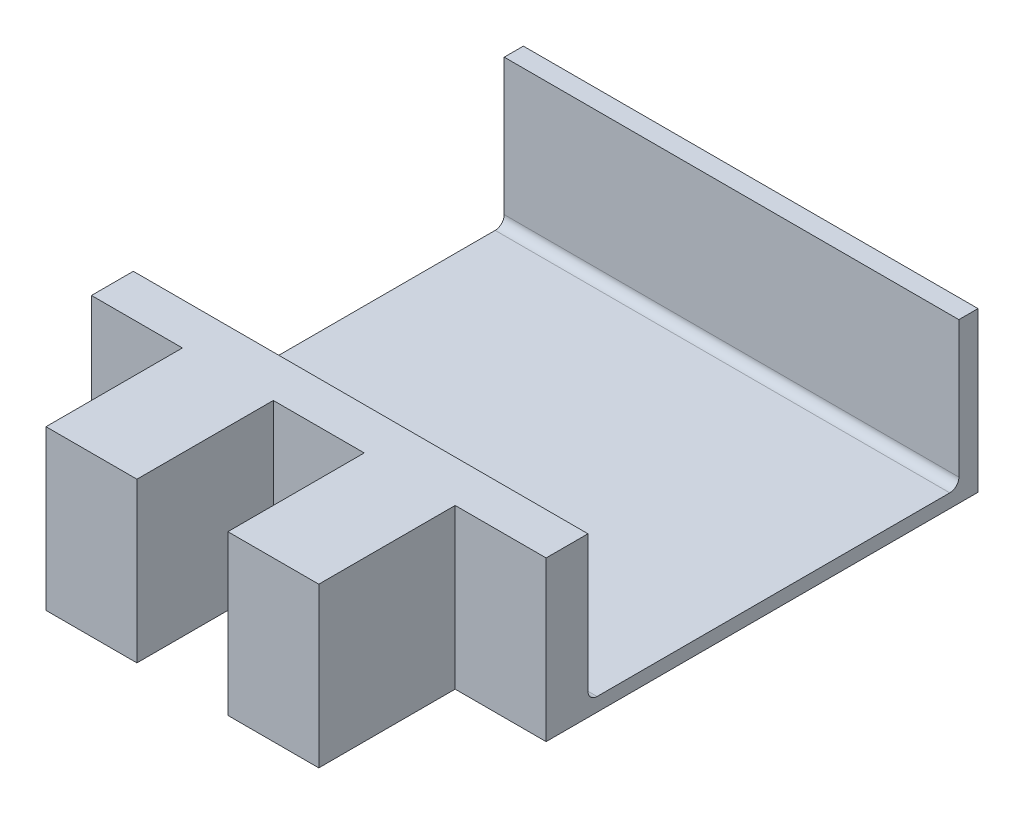
ISO-10303-21;
HEADER;
FILE_DESCRIPTION(('STEP AP214'),'2;1');
FILE_NAME('part.step','',(''),(''),'','','');
FILE_SCHEMA(('AUTOMOTIVE_DESIGN { 1 0 10303 214 1 1 1 1 }'));
ENDSEC;
DATA;
#1=APPLICATION_CONTEXT('core data for automotive mechanical design processes');
#2=APPLICATION_PROTOCOL_DEFINITION('international standard','automotive_design',2000,#1);
#3=PRODUCT_CONTEXT('',#1,'mechanical');
#4=PRODUCT('Part','Part','',(#3));
#5=PRODUCT_RELATED_PRODUCT_CATEGORY('part','',(#4));
#6=PRODUCT_DEFINITION_FORMATION('','',#4);
#7=PRODUCT_DEFINITION_CONTEXT('part definition',#1,'design');
#8=PRODUCT_DEFINITION('design','',#6,#7);
#9=PRODUCT_DEFINITION_SHAPE('','',#8);
#10=(LENGTH_UNIT() NAMED_UNIT(*) SI_UNIT(.MILLI.,.METRE.));
#11=(NAMED_UNIT(*) PLANE_ANGLE_UNIT() SI_UNIT($,.RADIAN.));
#12=(NAMED_UNIT(*) SI_UNIT($,.STERADIAN.) SOLID_ANGLE_UNIT());
#13=UNCERTAINTY_MEASURE_WITH_UNIT(LENGTH_MEASURE(1.E-05),#10,'distance_accuracy_value','');
#14=(GEOMETRIC_REPRESENTATION_CONTEXT(3) GLOBAL_UNCERTAINTY_ASSIGNED_CONTEXT((#13)) GLOBAL_UNIT_ASSIGNED_CONTEXT((#10,
#11,#12)) REPRESENTATION_CONTEXT('',''));
#15=CARTESIAN_POINT('',(0.,0.,0.));
#16=DIRECTION('',(0.,0.,1.));
#17=DIRECTION('',(1.,0.,0.));
#18=AXIS2_PLACEMENT_3D('',#15,#16,#17);
#19=CARTESIAN_POINT('',(0.,0.,80.));
#20=DIRECTION('',(0.,0.,1.));
#21=DIRECTION('',(1.,0.,0.));
#22=AXIS2_PLACEMENT_3D('',#19,#20,#21);
#23=PLANE('',#22);
#24=DIRECTION('',(1.,0.,0.));
#25=VECTOR('',#24,1.);
#26=CARTESIAN_POINT('',(22.5,-63.5,80.));
#27=LINE('',#26,#25);
#28=CARTESIAN_POINT('',(17.5,-63.5000000000001,80.));
#29=VERTEX_POINT('',#28);
#30=CARTESIAN_POINT('',(37.5,-63.5000000000001,80.));
#31=VERTEX_POINT('',#30);
#32=EDGE_CURVE('E269',#29,#31,#27,.T.);
#33=ORIENTED_EDGE('',*,*,#32,.T.);
#34=DIRECTION('',(0.,1.,0.));
#35=VECTOR('',#34,1.);
#36=CARTESIAN_POINT('',(37.5,-268.5,80.));
#37=LINE('',#36,#35);
#38=CARTESIAN_POINT('',(37.5,-28.5,80.));
#39=VERTEX_POINT('',#38);
#40=EDGE_CURVE('E167',#31,#39,#37,.T.);
#41=ORIENTED_EDGE('',*,*,#40,.T.);
#42=DIRECTION('',(-1.,0.,0.));
#43=VECTOR('',#42,1.);
#44=CARTESIAN_POINT('',(47.5,-28.5,80.));
#45=LINE('',#44,#43);
#46=CARTESIAN_POINT('',(17.5,-28.5,80.));
#47=VERTEX_POINT('',#46);
#48=EDGE_CURVE('E177',#39,#47,#45,.T.);
#49=ORIENTED_EDGE('',*,*,#48,.T.);
#50=DIRECTION('',(0.,1.,0.));
#51=VECTOR('',#50,1.);
#52=CARTESIAN_POINT('',(17.5,-268.5,80.));
#53=LINE('',#52,#51);
#54=EDGE_CURVE('E191',#29,#47,#53,.T.);
#55=ORIENTED_EDGE('',*,*,#54,.F.);
#56=EDGE_LOOP('',(#33,#41,#49,#55));
#57=FACE_BOUND('',#56,.T.);
#58=ADVANCED_FACE('F34',(#57),#23,.T.);
#59=CARTESIAN_POINT('',(57.5,-63.5,-45.));
#60=DIRECTION('',(0.,-1.,0.));
#61=DIRECTION('',(0.,0.,-1.));
#62=AXIS2_PLACEMENT_3D('',#59,#60,#61);
#63=PLANE('',#62);
#64=DIRECTION('',(0.,0.,1.));
#65=VECTOR('',#64,1.);
#66=CARTESIAN_POINT('',(57.5,-63.5,-45.));
#67=LINE('',#66,#65);
#68=CARTESIAN_POINT('',(57.5,-63.5,-45.));
#69=VERTEX_POINT('',#68);
#70=CARTESIAN_POINT('',(57.5,-63.5,50.));
#71=VERTEX_POINT('',#70);
#72=EDGE_CURVE('E280',#69,#71,#67,.T.);
#73=ORIENTED_EDGE('',*,*,#72,.T.);
#74=DIRECTION('',(-1.,0.,0.));
#75=VECTOR('',#74,1.);
#76=CARTESIAN_POINT('',(57.5,-63.5,50.));
#77=LINE('',#76,#75);
#78=CARTESIAN_POINT('',(37.5,-63.5000000000001,50.));
#79=VERTEX_POINT('',#78);
#80=EDGE_CURVE('E48',#71,#79,#77,.T.);
#81=ORIENTED_EDGE('',*,*,#80,.T.);
#82=DIRECTION('',(0.,0.,1.));
#83=VECTOR('',#82,1.);
#84=CARTESIAN_POINT('',(37.5,-63.5,-45.));
#85=LINE('',#84,#83);
#86=EDGE_CURVE('E166',#79,#31,#85,.T.);
#87=ORIENTED_EDGE('',*,*,#86,.T.);
#88=ORIENTED_EDGE('',*,*,#32,.F.);
#89=DIRECTION('',(0.,0.,-1.));
#90=VECTOR('',#89,1.);
#91=CARTESIAN_POINT('',(17.5,-63.5,-45.));
#92=LINE('',#91,#90);
#93=CARTESIAN_POINT('',(17.5,-63.5000000000001,50.));
#94=VERTEX_POINT('',#93);
#95=EDGE_CURVE('E205',#29,#94,#92,.T.);
#96=ORIENTED_EDGE('',*,*,#95,.T.);
#97=DIRECTION('',(-1.,0.,0.));
#98=VECTOR('',#97,1.);
#99=CARTESIAN_POINT('',(57.5,-63.5,50.));
#100=LINE('',#99,#98);
#101=CARTESIAN_POINT('',(-2.5,-63.5000000000001,50.));
#102=VERTEX_POINT('',#101);
#103=EDGE_CURVE('E193',#94,#102,#100,.T.);
#104=ORIENTED_EDGE('',*,*,#103,.T.);
#105=DIRECTION('',(0.,0.,1.));
#106=VECTOR('',#105,1.);
#107=CARTESIAN_POINT('',(-2.5,-63.5,-45.));
#108=LINE('',#107,#106);
#109=CARTESIAN_POINT('',(-2.5,-63.5000000000001,80.));
#110=VERTEX_POINT('',#109);
#111=EDGE_CURVE('E202',#102,#110,#108,.T.);
#112=ORIENTED_EDGE('',*,*,#111,.T.);
#113=CARTESIAN_POINT('',(-22.5,-63.5000000000001,80.));
#114=VERTEX_POINT('',#113);
#115=EDGE_CURVE('E270',#114,#110,#27,.T.);
#116=ORIENTED_EDGE('',*,*,#115,.F.);
#117=DIRECTION('',(0.,0.,-1.));
#118=VECTOR('',#117,1.);
#119=CARTESIAN_POINT('',(-22.5,-63.5,-45.));
#120=LINE('',#119,#118);
#121=CARTESIAN_POINT('',(-22.5,-63.5000000000001,50.));
#122=VERTEX_POINT('',#121);
#123=EDGE_CURVE('E222',#114,#122,#120,.T.);
#124=ORIENTED_EDGE('',*,*,#123,.T.);
#125=DIRECTION('',(-1.,0.,0.));
#126=VECTOR('',#125,1.);
#127=CARTESIAN_POINT('',(57.5,-63.5,50.));
#128=LINE('',#127,#126);
#129=CARTESIAN_POINT('',(-42.5,-63.5000000000001,50.));
#130=VERTEX_POINT('',#129);
#131=EDGE_CURVE('E218',#122,#130,#128,.T.);
#132=ORIENTED_EDGE('',*,*,#131,.T.);
#133=DIRECTION('',(0.,0.,-1.));
#134=VECTOR('',#133,1.);
#135=CARTESIAN_POINT('',(-42.5,-63.5,80.));
#136=LINE('',#135,#134);
#137=CARTESIAN_POINT('',(-42.5,-63.5,-45.));
#138=VERTEX_POINT('',#137);
#139=EDGE_CURVE('E256',#130,#138,#136,.T.);
#140=ORIENTED_EDGE('',*,*,#139,.T.);
#141=DIRECTION('',(-1.,0.,0.));
#142=VECTOR('',#141,1.);
#143=CARTESIAN_POINT('',(57.5,-63.5,-45.));
#144=LINE('',#143,#142);
#145=EDGE_CURVE('E283',#69,#138,#144,.T.);
#146=ORIENTED_EDGE('',*,*,#145,.F.);
#147=EDGE_LOOP('',(#73,#81,#87,#88,#96,#104,#112,#116,#124,#132,#140,#146));
#148=FACE_BOUND('',#147,.T.);
#149=ADVANCED_FACE('F302',(#148),#63,.T.);
#150=CARTESIAN_POINT('',(0.,-28.5,0.));
#151=DIRECTION('',(0.,-1.,0.));
#152=DIRECTION('',(0.,0.,-1.));
#153=AXIS2_PLACEMENT_3D('',#150,#151,#152);
#154=PLANE('',#153);
#155=DIRECTION('',(1.,0.,0.));
#156=VECTOR('',#155,1.);
#157=CARTESIAN_POINT('',(0.,-28.5,50.));
#158=LINE('',#157,#156);
#159=CARTESIAN_POINT('',(37.5,-28.5,50.));
#160=VERTEX_POINT('',#159);
#161=CARTESIAN_POINT('',(57.5,-28.5,50.));
#162=VERTEX_POINT('',#161);
#163=EDGE_CURVE('E170',#160,#162,#158,.T.);
#164=ORIENTED_EDGE('',*,*,#163,.T.);
#165=DIRECTION('',(0.,0.,1.));
#166=VECTOR('',#165,1.);
#167=CARTESIAN_POINT('',(57.5,-28.5,0.));
#168=LINE('',#167,#166);
#169=CARTESIAN_POINT('',(57.5,-28.5,40.7921561087423));
#170=VERTEX_POINT('',#169);
#171=EDGE_CURVE('E286',#170,#162,#168,.T.);
#172=ORIENTED_EDGE('',*,*,#171,.F.);
#173=DIRECTION('',(-1.,0.,0.));
#174=VECTOR('',#173,1.);
#175=CARTESIAN_POINT('',(57.5,-28.5,40.7921561087423));
#176=LINE('',#175,#174);
#177=CARTESIAN_POINT('',(-42.5,-28.5,40.7921561087423));
#178=VERTEX_POINT('',#177);
#179=EDGE_CURVE('E274',#170,#178,#176,.T.);
#180=ORIENTED_EDGE('',*,*,#179,.T.);
#181=DIRECTION('',(0.,0.,1.));
#182=VECTOR('',#181,1.);
#183=CARTESIAN_POINT('',(-42.5,-28.5,40.7921561087423));
#184=LINE('',#183,#182);
#185=CARTESIAN_POINT('',(-42.5,-28.5,50.));
#186=VERTEX_POINT('',#185);
#187=EDGE_CURVE('E264',#178,#186,#184,.T.);
#188=ORIENTED_EDGE('',*,*,#187,.T.);
#189=DIRECTION('',(1.,0.,0.));
#190=VECTOR('',#189,1.);
#191=CARTESIAN_POINT('',(0.,-28.5,50.));
#192=LINE('',#191,#190);
#193=CARTESIAN_POINT('',(-22.5,-28.5,50.));
#194=VERTEX_POINT('',#193);
#195=EDGE_CURVE('E211',#186,#194,#192,.T.);
#196=ORIENTED_EDGE('',*,*,#195,.T.);
#197=DIRECTION('',(0.,0.,1.));
#198=VECTOR('',#197,1.);
#199=CARTESIAN_POINT('',(-22.5,-28.5,0.));
#200=LINE('',#199,#198);
#201=CARTESIAN_POINT('',(-22.5,-28.5,80.));
#202=VERTEX_POINT('',#201);
#203=EDGE_CURVE('E208',#194,#202,#200,.T.);
#204=ORIENTED_EDGE('',*,*,#203,.T.);
#205=CARTESIAN_POINT('',(-2.5,-28.5,80.));
#206=VERTEX_POINT('',#205);
#207=EDGE_CURVE('E267',#206,#202,#45,.T.);
#208=ORIENTED_EDGE('',*,*,#207,.F.);
#209=DIRECTION('',(0.,0.,-1.));
#210=VECTOR('',#209,1.);
#211=CARTESIAN_POINT('',(-2.5,-28.5,0.));
#212=LINE('',#211,#210);
#213=CARTESIAN_POINT('',(-2.5,-28.5,50.));
#214=VERTEX_POINT('',#213);
#215=EDGE_CURVE('E187',#206,#214,#212,.T.);
#216=ORIENTED_EDGE('',*,*,#215,.T.);
#217=DIRECTION('',(1.,0.,0.));
#218=VECTOR('',#217,1.);
#219=CARTESIAN_POINT('',(0.,-28.5,50.));
#220=LINE('',#219,#218);
#221=CARTESIAN_POINT('',(17.5,-28.5,50.));
#222=VERTEX_POINT('',#221);
#223=EDGE_CURVE('E184',#214,#222,#220,.T.);
#224=ORIENTED_EDGE('',*,*,#223,.T.);
#225=DIRECTION('',(0.,0.,1.));
#226=VECTOR('',#225,1.);
#227=CARTESIAN_POINT('',(17.5,-28.5,0.));
#228=LINE('',#227,#226);
#229=EDGE_CURVE('E56',#222,#47,#228,.T.);
#230=ORIENTED_EDGE('',*,*,#229,.T.);
#231=ORIENTED_EDGE('',*,*,#48,.F.);
#232=DIRECTION('',(0.,0.,-1.));
#233=VECTOR('',#232,1.);
#234=CARTESIAN_POINT('',(37.5,-28.5,0.));
#235=LINE('',#234,#233);
#236=EDGE_CURVE('E163',#39,#160,#235,.T.);
#237=ORIENTED_EDGE('',*,*,#236,.T.);
#238=EDGE_LOOP('',(#164,#172,#180,#188,#196,#204,#208,#216,#224,#230,#231,#237));
#239=FACE_BOUND('',#238,.T.);
#240=ADVANCED_FACE('F36',(#239),#154,.F.);
#241=CARTESIAN_POINT('',(57.5,-18.5,0.));
#242=DIRECTION('',(-1.,0.,0.));
#243=DIRECTION('',(0.,0.,1.));
#244=AXIS2_PLACEMENT_3D('',#241,#242,#243);
#245=PLANE('',#244);
#246=DIRECTION('',(0.,1.,0.));
#247=VECTOR('',#246,1.);
#248=CARTESIAN_POINT('',(57.5,-18.5,50.));
#249=LINE('',#248,#247);
#250=EDGE_CURVE('E12',#71,#162,#249,.T.);
#251=ORIENTED_EDGE('',*,*,#250,.F.);
#252=ORIENTED_EDGE('',*,*,#72,.F.);
#253=DIRECTION('',(0.,-1.,0.));
#254=VECTOR('',#253,1.);
#255=CARTESIAN_POINT('',(57.5,-23.5,-45.));
#256=LINE('',#255,#254);
#257=CARTESIAN_POINT('',(57.5,-28.5,-45.));
#258=VERTEX_POINT('',#257);
#259=EDGE_CURVE('E273',#258,#69,#256,.T.);
#260=ORIENTED_EDGE('',*,*,#259,.F.);
#261=CARTESIAN_POINT('',(57.5,-28.5,-40.7921561087423));
#262=VERTEX_POINT('',#261);
#263=EDGE_CURVE('E287',#258,#262,#168,.T.);
#264=ORIENTED_EDGE('',*,*,#263,.T.);
#265=DIRECTION('',(0.,1.,0.));
#266=VECTOR('',#265,1.);
#267=CARTESIAN_POINT('',(57.5,-28.5,-40.7921561087423));
#268=LINE('',#267,#266);
#269=CARTESIAN_POINT('',(57.5,-58.5,-40.7921561087423));
#270=VERTEX_POINT('',#269);
#271=EDGE_CURVE('E245',#270,#262,#268,.T.);
#272=ORIENTED_EDGE('',*,*,#271,.F.);
#273=CARTESIAN_POINT('',(57.5,-58.5,-38.7921561087423));
#274=DIRECTION('',(1.,0.,0.));
#275=DIRECTION('',(0.,0.,-1.));
#276=AXIS2_PLACEMENT_3D('',#273,#274,#275);
#277=CIRCLE('',#276,2.);
#278=CARTESIAN_POINT('',(57.5,-60.5,-38.7921561087423));
#279=VERTEX_POINT('',#278);
#280=EDGE_CURVE('E242',#279,#270,#277,.T.);
#281=ORIENTED_EDGE('',*,*,#280,.F.);
#282=DIRECTION('',(0.,0.,-1.));
#283=VECTOR('',#282,1.);
#284=CARTESIAN_POINT('',(57.5,-60.5,38.7921561087423));
#285=LINE('',#284,#283);
#286=CARTESIAN_POINT('',(57.5,-60.5,38.7921561087423));
#287=VERTEX_POINT('',#286);
#288=EDGE_CURVE('E240',#287,#279,#285,.T.);
#289=ORIENTED_EDGE('',*,*,#288,.F.);
#290=CARTESIAN_POINT('',(57.5,-58.5,38.7921561087423));
#291=DIRECTION('',(1.,0.,0.));
#292=DIRECTION('',(0.,0.,-1.));
#293=AXIS2_PLACEMENT_3D('',#290,#291,#292);
#294=CIRCLE('',#293,2.);
#295=CARTESIAN_POINT('',(57.5,-58.5,40.7921561087423));
#296=VERTEX_POINT('',#295);
#297=EDGE_CURVE('E237',#296,#287,#294,.T.);
#298=ORIENTED_EDGE('',*,*,#297,.F.);
#299=DIRECTION('',(0.,-1.,0.));
#300=VECTOR('',#299,1.);
#301=CARTESIAN_POINT('',(57.5,-28.5,40.7921561087423));
#302=LINE('',#301,#300);
#303=EDGE_CURVE('E225',#170,#296,#302,.T.);
#304=ORIENTED_EDGE('',*,*,#303,.F.);
#305=ORIENTED_EDGE('',*,*,#171,.T.);
#306=EDGE_LOOP('',(#251,#252,#260,#264,#272,#281,#289,#298,#304,#305));
#307=FACE_BOUND('',#306,.T.);
#308=ADVANCED_FACE('F315',(#307),#245,.F.);
#309=ORIENTED_EDGE('',*,*,#115,.T.);
#310=DIRECTION('',(0.,1.,0.));
#311=VECTOR('',#310,1.);
#312=CARTESIAN_POINT('',(-2.5,-268.5,80.));
#313=LINE('',#312,#311);
#314=EDGE_CURVE('E194',#110,#206,#313,.T.);
#315=ORIENTED_EDGE('',*,*,#314,.T.);
#316=ORIENTED_EDGE('',*,*,#207,.T.);
#317=DIRECTION('',(0.,1.,0.));
#318=VECTOR('',#317,1.);
#319=CARTESIAN_POINT('',(-22.5,-268.5,80.));
#320=LINE('',#319,#318);
#321=EDGE_CURVE('E215',#114,#202,#320,.T.);
#322=ORIENTED_EDGE('',*,*,#321,.F.);
#323=EDGE_LOOP('',(#309,#315,#316,#322));
#324=FACE_BOUND('',#323,.T.);
#325=ADVANCED_FACE('F345',(#324),#23,.T.);
#326=CARTESIAN_POINT('',(-42.5,-18.5,0.));
#327=DIRECTION('',(1.,0.,0.));
#328=DIRECTION('',(0.,0.,-1.));
#329=AXIS2_PLACEMENT_3D('',#326,#327,#328);
#330=PLANE('',#329);
#331=DIRECTION('',(0.,-1.,0.));
#332=VECTOR('',#331,1.);
#333=CARTESIAN_POINT('',(-42.5,-18.5,50.));
#334=LINE('',#333,#332);
#335=EDGE_CURVE('E42',#186,#130,#334,.T.);
#336=ORIENTED_EDGE('',*,*,#335,.F.);
#337=ORIENTED_EDGE('',*,*,#187,.F.);
#338=DIRECTION('',(0.,1.,0.));
#339=VECTOR('',#338,1.);
#340=CARTESIAN_POINT('',(-42.5,-28.5,40.7921561087423));
#341=LINE('',#340,#339);
#342=CARTESIAN_POINT('',(-42.5,-58.5,40.7921561087423));
#343=VERTEX_POINT('',#342);
#344=EDGE_CURVE('E232',#343,#178,#341,.T.);
#345=ORIENTED_EDGE('',*,*,#344,.F.);
#346=CARTESIAN_POINT('',(-42.5,-58.5,38.7921561087423));
#347=DIRECTION('',(1.,0.,0.));
#348=DIRECTION('',(0.,0.,-1.));
#349=AXIS2_PLACEMENT_3D('',#346,#347,#348);
#350=CIRCLE('',#349,2.);
#351=CARTESIAN_POINT('',(-42.5,-60.5,38.7921561087423));
#352=VERTEX_POINT('',#351);
#353=EDGE_CURVE('E234',#352,#343,#350,.F.);
#354=ORIENTED_EDGE('',*,*,#353,.F.);
#355=DIRECTION('',(0.,0.,-1.));
#356=VECTOR('',#355,1.);
#357=CARTESIAN_POINT('',(-42.5,-60.5,0.));
#358=LINE('',#357,#356);
#359=CARTESIAN_POINT('',(-42.5,-60.5,-38.7921561087423));
#360=VERTEX_POINT('',#359);
#361=EDGE_CURVE('E277',#352,#360,#358,.T.);
#362=ORIENTED_EDGE('',*,*,#361,.T.);
#363=CARTESIAN_POINT('',(-42.5,-58.5,-38.7921561087423));
#364=DIRECTION('',(1.,0.,0.));
#365=DIRECTION('',(0.,0.,-1.));
#366=AXIS2_PLACEMENT_3D('',#363,#364,#365);
#367=CIRCLE('',#366,2.);
#368=CARTESIAN_POINT('',(-42.5,-58.5,-40.7921561087423));
#369=VERTEX_POINT('',#368);
#370=EDGE_CURVE('E226',#369,#360,#367,.F.);
#371=ORIENTED_EDGE('',*,*,#370,.F.);
#372=DIRECTION('',(0.,-1.,0.));
#373=VECTOR('',#372,1.);
#374=CARTESIAN_POINT('',(-42.5,-28.5,-40.7921561087423));
#375=LINE('',#374,#373);
#376=CARTESIAN_POINT('',(-42.5,-28.5,-40.7921561087423));
#377=VERTEX_POINT('',#376);
#378=EDGE_CURVE('E229',#377,#369,#375,.T.);
#379=ORIENTED_EDGE('',*,*,#378,.F.);
#380=DIRECTION('',(0.,0.,1.));
#381=VECTOR('',#380,1.);
#382=CARTESIAN_POINT('',(-42.5,-28.5,-45.));
#383=LINE('',#382,#381);
#384=CARTESIAN_POINT('',(-42.5,-28.5,-45.));
#385=VERTEX_POINT('',#384);
#386=EDGE_CURVE('E261',#385,#377,#383,.T.);
#387=ORIENTED_EDGE('',*,*,#386,.F.);
#388=DIRECTION('',(0.,1.,0.));
#389=VECTOR('',#388,1.);
#390=CARTESIAN_POINT('',(-42.5,-63.5,-45.));
#391=LINE('',#390,#389);
#392=EDGE_CURVE('E258',#138,#385,#391,.T.);
#393=ORIENTED_EDGE('',*,*,#392,.F.);
#394=ORIENTED_EDGE('',*,*,#139,.F.);
#395=EDGE_LOOP('',(#336,#337,#345,#354,#362,#371,#379,#387,#393,#394));
#396=FACE_BOUND('',#395,.T.);
#397=ADVANCED_FACE('F306',(#396),#330,.F.);
#398=DIRECTION('',(-1.,0.,0.));
#399=VECTOR('',#398,1.);
#400=CARTESIAN_POINT('',(57.5,-28.5,-45.));
#401=LINE('',#400,#399);
#402=EDGE_CURVE('E290',#258,#385,#401,.T.);
#403=ORIENTED_EDGE('',*,*,#402,.T.);
#404=ORIENTED_EDGE('',*,*,#386,.T.);
#405=DIRECTION('',(-1.,0.,0.));
#406=VECTOR('',#405,1.);
#407=CARTESIAN_POINT('',(57.5,-28.5,-40.7921561087423));
#408=LINE('',#407,#406);
#409=EDGE_CURVE('E278',#377,#262,#408,.F.);
#410=ORIENTED_EDGE('',*,*,#409,.T.);
#411=ORIENTED_EDGE('',*,*,#263,.F.);
#412=EDGE_LOOP('',(#403,#404,#410,#411));
#413=FACE_BOUND('',#412,.T.);
#414=ADVANCED_FACE('F339',(#413),#154,.F.);
#415=CARTESIAN_POINT('',(57.5,-23.5,-45.));
#416=DIRECTION('',(0.,0.,-1.));
#417=DIRECTION('',(-1.,0.,0.));
#418=AXIS2_PLACEMENT_3D('',#415,#416,#417);
#419=PLANE('',#418);
#420=ORIENTED_EDGE('',*,*,#145,.T.);
#421=ORIENTED_EDGE('',*,*,#392,.T.);
#422=ORIENTED_EDGE('',*,*,#402,.F.);
#423=ORIENTED_EDGE('',*,*,#259,.T.);
#424=EDGE_LOOP('',(#420,#421,#422,#423));
#425=FACE_BOUND('',#424,.T.);
#426=ADVANCED_FACE('F310',(#425),#419,.T.);
#427=CARTESIAN_POINT('',(-130.135609200827,-60.5,38.7921561087423));
#428=DIRECTION('',(0.,-1.,0.));
#429=DIRECTION('',(0.,0.,-1.));
#430=AXIS2_PLACEMENT_3D('',#427,#428,#429);
#431=PLANE('',#430);
#432=ORIENTED_EDGE('',*,*,#288,.T.);
#433=DIRECTION('',(1.,0.,0.));
#434=VECTOR('',#433,1.);
#435=CARTESIAN_POINT('',(-130.135609200827,-60.5,-38.7921561087423));
#436=LINE('',#435,#434);
#437=EDGE_CURVE('E249',#360,#279,#436,.T.);
#438=ORIENTED_EDGE('',*,*,#437,.F.);
#439=ORIENTED_EDGE('',*,*,#361,.F.);
#440=DIRECTION('',(1.,0.,0.));
#441=VECTOR('',#440,1.);
#442=CARTESIAN_POINT('',(-130.135609200827,-60.5,38.7921561087423));
#443=LINE('',#442,#441);
#444=EDGE_CURVE('E252',#352,#287,#443,.T.);
#445=ORIENTED_EDGE('',*,*,#444,.T.);
#446=EDGE_LOOP('',(#432,#438,#439,#445));
#447=FACE_BOUND('',#446,.T.);
#448=ADVANCED_FACE('F329',(#447),#431,.F.);
#449=CARTESIAN_POINT('',(-130.135609200827,-28.5,40.7921561087423));
#450=DIRECTION('',(0.,0.,1.));
#451=DIRECTION('',(0.,-1.,0.));
#452=AXIS2_PLACEMENT_3D('',#449,#450,#451);
#453=PLANE('',#452);
#454=ORIENTED_EDGE('',*,*,#344,.T.);
#455=ORIENTED_EDGE('',*,*,#179,.F.);
#456=ORIENTED_EDGE('',*,*,#303,.T.);
#457=DIRECTION('',(1.,0.,0.));
#458=VECTOR('',#457,1.);
#459=CARTESIAN_POINT('',(-130.135609200827,-58.5,40.7921561087423));
#460=LINE('',#459,#458);
#461=EDGE_CURVE('E247',#343,#296,#460,.T.);
#462=ORIENTED_EDGE('',*,*,#461,.F.);
#463=EDGE_LOOP('',(#454,#455,#456,#462));
#464=FACE_BOUND('',#463,.T.);
#465=ADVANCED_FACE('F322',(#464),#453,.F.);
#466=CARTESIAN_POINT('',(-130.135609200827,-28.5,-40.7921561087423));
#467=DIRECTION('',(0.,0.,-1.));
#468=DIRECTION('',(-1.,0.,0.));
#469=AXIS2_PLACEMENT_3D('',#466,#467,#468);
#470=PLANE('',#469);
#471=ORIENTED_EDGE('',*,*,#378,.T.);
#472=DIRECTION('',(1.,0.,0.));
#473=VECTOR('',#472,1.);
#474=CARTESIAN_POINT('',(-130.135609200827,-58.5,-40.7921561087423));
#475=LINE('',#474,#473);
#476=EDGE_CURVE('E230',#369,#270,#475,.T.);
#477=ORIENTED_EDGE('',*,*,#476,.T.);
#478=ORIENTED_EDGE('',*,*,#271,.T.);
#479=ORIENTED_EDGE('',*,*,#409,.F.);
#480=EDGE_LOOP('',(#471,#477,#478,#479));
#481=FACE_BOUND('',#480,.T.);
#482=ADVANCED_FACE('F337',(#481),#470,.F.);
#483=CARTESIAN_POINT('',(-130.135609200827,-58.5,-38.7921561087423));
#484=DIRECTION('',(1.,0.,0.));
#485=DIRECTION('',(0.,0.,-1.));
#486=AXIS2_PLACEMENT_3D('',#483,#484,#485);
#487=CYLINDRICAL_SURFACE('',#486,2.);
#488=ORIENTED_EDGE('',*,*,#370,.T.);
#489=ORIENTED_EDGE('',*,*,#437,.T.);
#490=ORIENTED_EDGE('',*,*,#280,.T.);
#491=ORIENTED_EDGE('',*,*,#476,.F.);
#492=EDGE_LOOP('',(#488,#489,#490,#491));
#493=FACE_BOUND('',#492,.T.);
#494=ADVANCED_FACE('F333',(#493),#487,.F.);
#495=CARTESIAN_POINT('',(-130.135609200827,-58.5,38.7921561087423));
#496=DIRECTION('',(1.,0.,0.));
#497=DIRECTION('',(0.,0.,-1.));
#498=AXIS2_PLACEMENT_3D('',#495,#496,#497);
#499=CYLINDRICAL_SURFACE('',#498,2.);
#500=ORIENTED_EDGE('',*,*,#353,.T.);
#501=ORIENTED_EDGE('',*,*,#461,.T.);
#502=ORIENTED_EDGE('',*,*,#297,.T.);
#503=ORIENTED_EDGE('',*,*,#444,.F.);
#504=EDGE_LOOP('',(#500,#501,#502,#503));
#505=FACE_BOUND('',#504,.T.);
#506=ADVANCED_FACE('F324',(#505),#499,.F.);
#507=CARTESIAN_POINT('',(-22.5,-268.5,0.));
#508=DIRECTION('',(-1.,0.,0.));
#509=DIRECTION('',(0.,0.,1.));
#510=AXIS2_PLACEMENT_3D('',#507,#508,#509);
#511=PLANE('',#510);
#512=ORIENTED_EDGE('',*,*,#321,.T.);
#513=ORIENTED_EDGE('',*,*,#203,.F.);
#514=DIRECTION('',(0.,1.,0.));
#515=VECTOR('',#514,1.);
#516=CARTESIAN_POINT('',(-22.5,-268.5,50.));
#517=LINE('',#516,#515);
#518=EDGE_CURVE('E214',#122,#194,#517,.T.);
#519=ORIENTED_EDGE('',*,*,#518,.F.);
#520=ORIENTED_EDGE('',*,*,#123,.F.);
#521=EDGE_LOOP('',(#512,#513,#519,#520));
#522=FACE_BOUND('',#521,.T.);
#523=ADVANCED_FACE('F374',(#522),#511,.T.);
#524=CARTESIAN_POINT('',(0.,-268.5,50.));
#525=DIRECTION('',(0.,0.,1.));
#526=DIRECTION('',(1.,0.,0.));
#527=AXIS2_PLACEMENT_3D('',#524,#525,#526);
#528=PLANE('',#527);
#529=ORIENTED_EDGE('',*,*,#518,.T.);
#530=ORIENTED_EDGE('',*,*,#195,.F.);
#531=ORIENTED_EDGE('',*,*,#335,.T.);
#532=ORIENTED_EDGE('',*,*,#131,.F.);
#533=EDGE_LOOP('',(#529,#530,#531,#532));
#534=FACE_BOUND('',#533,.T.);
#535=ADVANCED_FACE('F296',(#534),#528,.T.);
#536=CARTESIAN_POINT('',(17.5,-268.5,0.));
#537=DIRECTION('',(-1.,0.,0.));
#538=DIRECTION('',(0.,0.,1.));
#539=AXIS2_PLACEMENT_3D('',#536,#537,#538);
#540=PLANE('',#539);
#541=ORIENTED_EDGE('',*,*,#54,.T.);
#542=ORIENTED_EDGE('',*,*,#229,.F.);
#543=DIRECTION('',(0.,1.,0.));
#544=VECTOR('',#543,1.);
#545=CARTESIAN_POINT('',(17.5,-268.5,50.));
#546=LINE('',#545,#544);
#547=EDGE_CURVE('E190',#94,#222,#546,.T.);
#548=ORIENTED_EDGE('',*,*,#547,.F.);
#549=ORIENTED_EDGE('',*,*,#95,.F.);
#550=EDGE_LOOP('',(#541,#542,#548,#549));
#551=FACE_BOUND('',#550,.T.);
#552=ADVANCED_FACE('F381',(#551),#540,.T.);
#553=CARTESIAN_POINT('',(-2.5,-268.5,0.));
#554=DIRECTION('',(1.,0.,0.));
#555=DIRECTION('',(0.,0.,-1.));
#556=AXIS2_PLACEMENT_3D('',#553,#554,#555);
#557=PLANE('',#556);
#558=DIRECTION('',(0.,1.,0.));
#559=VECTOR('',#558,1.);
#560=CARTESIAN_POINT('',(-2.5,-268.5,50.));
#561=LINE('',#560,#559);
#562=EDGE_CURVE('E197',#102,#214,#561,.T.);
#563=ORIENTED_EDGE('',*,*,#562,.T.);
#564=ORIENTED_EDGE('',*,*,#215,.F.);
#565=ORIENTED_EDGE('',*,*,#314,.F.);
#566=ORIENTED_EDGE('',*,*,#111,.F.);
#567=EDGE_LOOP('',(#563,#564,#565,#566));
#568=FACE_BOUND('',#567,.T.);
#569=ADVANCED_FACE('F368',(#568),#557,.T.);
#570=CARTESIAN_POINT('',(0.,-268.5,50.));
#571=DIRECTION('',(0.,0.,1.));
#572=DIRECTION('',(1.,0.,0.));
#573=AXIS2_PLACEMENT_3D('',#570,#571,#572);
#574=PLANE('',#573);
#575=ORIENTED_EDGE('',*,*,#547,.T.);
#576=ORIENTED_EDGE('',*,*,#223,.F.);
#577=ORIENTED_EDGE('',*,*,#562,.F.);
#578=ORIENTED_EDGE('',*,*,#103,.F.);
#579=EDGE_LOOP('',(#575,#576,#577,#578));
#580=FACE_BOUND('',#579,.T.);
#581=ADVANCED_FACE('F371',(#580),#574,.T.);
#582=CARTESIAN_POINT('',(0.,-268.5,50.));
#583=DIRECTION('',(0.,0.,1.));
#584=DIRECTION('',(1.,0.,0.));
#585=AXIS2_PLACEMENT_3D('',#582,#583,#584);
#586=PLANE('',#585);
#587=ORIENTED_EDGE('',*,*,#250,.T.);
#588=ORIENTED_EDGE('',*,*,#163,.F.);
#589=DIRECTION('',(0.,1.,0.));
#590=VECTOR('',#589,1.);
#591=CARTESIAN_POINT('',(37.5,-268.5,50.));
#592=LINE('',#591,#590);
#593=EDGE_CURVE('E159',#79,#160,#592,.T.);
#594=ORIENTED_EDGE('',*,*,#593,.F.);
#595=ORIENTED_EDGE('',*,*,#80,.F.);
#596=EDGE_LOOP('',(#587,#588,#594,#595));
#597=FACE_BOUND('',#596,.T.);
#598=ADVANCED_FACE('F171',(#597),#586,.T.);
#599=CARTESIAN_POINT('',(37.5,-268.5,0.));
#600=DIRECTION('',(1.,0.,0.));
#601=DIRECTION('',(0.,0.,-1.));
#602=AXIS2_PLACEMENT_3D('',#599,#600,#601);
#603=PLANE('',#602);
#604=ORIENTED_EDGE('',*,*,#593,.T.);
#605=ORIENTED_EDGE('',*,*,#236,.F.);
#606=ORIENTED_EDGE('',*,*,#40,.F.);
#607=ORIENTED_EDGE('',*,*,#86,.F.);
#608=EDGE_LOOP('',(#604,#605,#606,#607));
#609=FACE_BOUND('',#608,.T.);
#610=ADVANCED_FACE('F161',(#609),#603,.T.);
#611=CLOSED_SHELL('',(#58,#149,#240,#308,#325,#397,#414,#426,#448,#465,#482,#494,#506,#523,#535,
#552,#569,#581,#598,#610));
#612=MANIFOLD_SOLID_BREP('B2',#611);
#613=ADVANCED_BREP_SHAPE_REPRESENTATION('',(#18,#612),#14);
#614=SHAPE_DEFINITION_REPRESENTATION(#9,#613);
ENDSEC;
END-ISO-10303-21;
